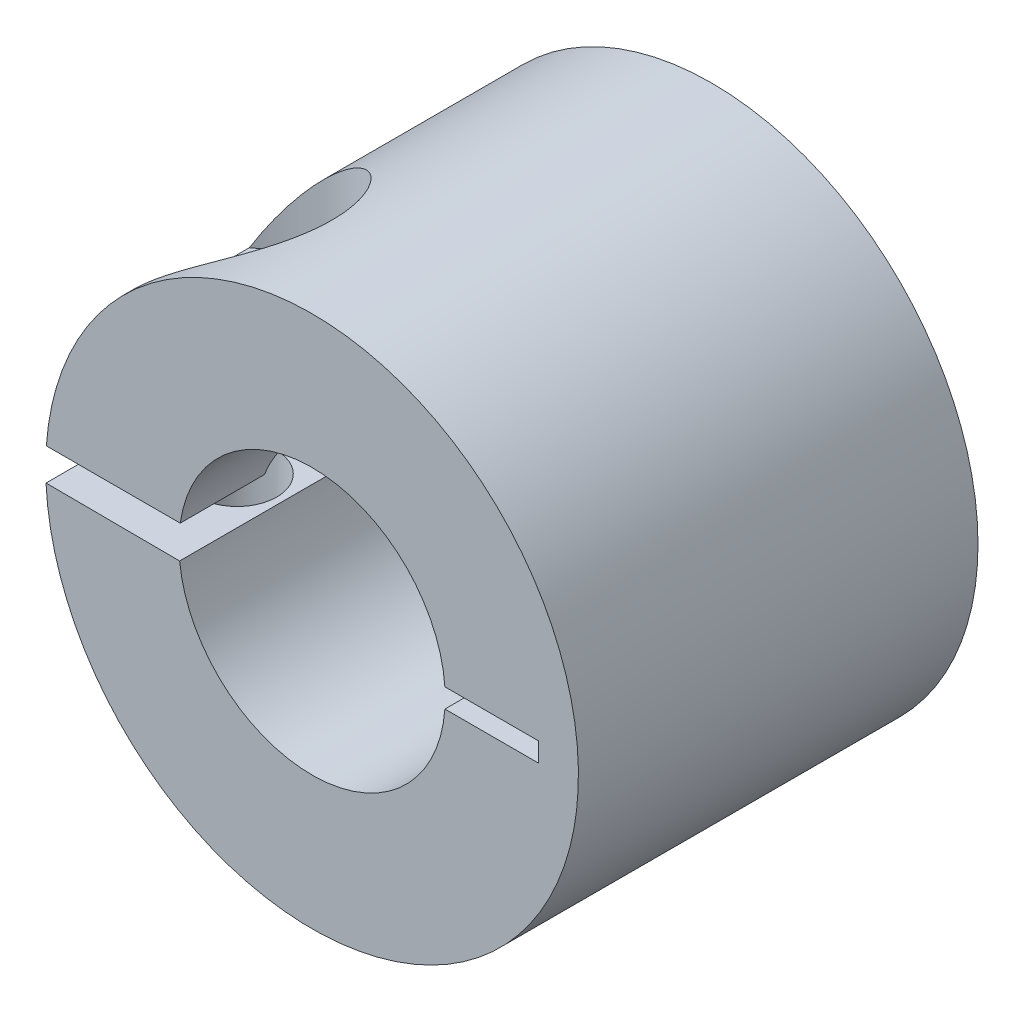
ISO-10303-21;
HEADER;
FILE_DESCRIPTION(('STEP AP214'),'2;1');
FILE_NAME('part.step','',(''),(''),'','','');
FILE_SCHEMA(('AUTOMOTIVE_DESIGN { 1 0 10303 214 1 1 1 1 }'));
ENDSEC;
DATA;
#1=APPLICATION_CONTEXT('core data for automotive mechanical design processes');
#2=APPLICATION_PROTOCOL_DEFINITION('international standard','automotive_design',2000,#1);
#3=PRODUCT_CONTEXT('',#1,'mechanical');
#4=PRODUCT('Part','Part','',(#3));
#5=PRODUCT_RELATED_PRODUCT_CATEGORY('part','',(#4));
#6=PRODUCT_DEFINITION_FORMATION('','',#4);
#7=PRODUCT_DEFINITION_CONTEXT('part definition',#1,'design');
#8=PRODUCT_DEFINITION('design','',#6,#7);
#9=PRODUCT_DEFINITION_SHAPE('','',#8);
#10=(LENGTH_UNIT() NAMED_UNIT(*) SI_UNIT(.MILLI.,.METRE.));
#11=(NAMED_UNIT(*) PLANE_ANGLE_UNIT() SI_UNIT($,.RADIAN.));
#12=(NAMED_UNIT(*) SI_UNIT($,.STERADIAN.) SOLID_ANGLE_UNIT());
#13=UNCERTAINTY_MEASURE_WITH_UNIT(LENGTH_MEASURE(1.E-05),#10,'distance_accuracy_value','');
#14=(GEOMETRIC_REPRESENTATION_CONTEXT(3) GLOBAL_UNCERTAINTY_ASSIGNED_CONTEXT((#13)) GLOBAL_UNIT_ASSIGNED_CONTEXT((#10,
#11,#12)) REPRESENTATION_CONTEXT('',''));
#15=CARTESIAN_POINT('',(0.,0.,0.));
#16=DIRECTION('',(0.,0.,1.));
#17=DIRECTION('',(1.,0.,0.));
#18=AXIS2_PLACEMENT_3D('',#15,#16,#17);
#19=CARTESIAN_POINT('',(0.,0.,11.));
#20=DIRECTION('',(0.,0.,-1.));
#21=DIRECTION('',(-1.,0.,0.));
#22=AXIS2_PLACEMENT_3D('',#19,#20,#21);
#23=CYLINDRICAL_SURFACE('',#22,14.);
#24=CARTESIAN_POINT('',(-11.5526790411999,-7.90794581234726,5.54027114214955));
#25=CARTESIAN_POINT('',(-11.5526748789258,-7.90795272536552,5.61203625396769));
#26=CARTESIAN_POINT('',(-11.5489929443179,-7.91333902765709,5.68383878191136));
#27=CARTESIAN_POINT('',(-11.5346125806077,-7.93428400988953,5.82523257353896));
#28=CARTESIAN_POINT('',(-11.5239050377526,-7.9498559026911,5.89482084173525));
#29=CARTESIAN_POINT('',(-11.4930315740365,-7.99444270107197,6.04637547896843));
#30=CARTESIAN_POINT('',(-11.4712136993282,-8.0257851887035,6.12731063718396));
#31=CARTESIAN_POINT('',(-11.4200360487427,-8.09844145867685,6.28196744460272));
#32=CARTESIAN_POINT('',(-11.3906615647856,-8.13977467725418,6.35567463454095));
#33=CARTESIAN_POINT('',(-11.3091277463506,-8.2529173406958,6.53230925769992));
#34=CARTESIAN_POINT('',(-11.253076026746,-8.32937719033758,6.63042241483548));
#35=CARTESIAN_POINT('',(-11.1309925227456,-8.49184379696413,6.81130122132944));
#36=CARTESIAN_POINT('',(-11.0649366745893,-8.57787343677205,6.89402876345338));
#37=CARTESIAN_POINT('',(-10.9411480975672,-8.73492227838304,7.02810304253912));
#38=CARTESIAN_POINT('',(-10.8850133399113,-8.80482293777624,7.08228561138151));
#39=CARTESIAN_POINT('',(-10.7686467885749,-8.94676862582325,7.18297814039746));
#40=CARTESIAN_POINT('',(-10.7084129430689,-9.01881471808823,7.22948421755897));
#41=CARTESIAN_POINT('',(-10.5842733070919,-9.16418592151429,7.31511557245384));
#42=CARTESIAN_POINT('',(-10.5203654099437,-9.2375117493447,7.35423655943337));
#43=CARTESIAN_POINT('',(-10.389224631331,-9.38476105263162,7.42518971782131));
#44=CARTESIAN_POINT('',(-10.3219904794634,-9.4586847472736,7.45701907778003));
#45=CARTESIAN_POINT('',(-10.182592794723,-9.60861899400804,7.51410739664203));
#46=CARTESIAN_POINT('',(-10.1103440248277,-9.68463015176237,7.53915795943815));
#47=CARTESIAN_POINT('',(-9.9630182447546,-9.83613128906178,7.58127339388821));
#48=CARTESIAN_POINT('',(-9.88794012609106,-9.91162105033572,7.59833509976474));
#49=CARTESIAN_POINT('',(-9.6591997402812,-10.136331792456,7.63697174553692));
#50=CARTESIAN_POINT('',(-9.5017128875386,-10.2841381621243,7.64613028362006));
#51=CARTESIAN_POINT('',(-9.21366194217896,-10.5422043793,7.62896872848511));
#52=CARTESIAN_POINT('',(-9.08406868497212,-10.6540277054776,7.60942698413341));
#53=CARTESIAN_POINT('',(-8.82485298807189,-10.8696923472061,7.54379001126941));
#54=CARTESIAN_POINT('',(-8.69523076566285,-10.9735429810364,7.49772633337225));
#55=CARTESIAN_POINT('',(-8.46626842026619,-11.1507402007235,7.38853257713525));
#56=CARTESIAN_POINT('',(-8.36600086590635,-11.2260619160469,7.33056517219441));
#57=CARTESIAN_POINT('',(-8.17249913866361,-11.367698676702,7.19509004534897));
#58=CARTESIAN_POINT('',(-8.07925750660957,-11.4340233355274,7.11760343711104));
#59=CARTESIAN_POINT('',(-7.9177287611714,-11.5463308689711,6.95663690844773));
#60=CARTESIAN_POINT('',(-7.84780677131883,-11.5938734475902,6.87589175195317));
#61=CARTESIAN_POINT('',(-7.71930708817429,-11.6798234243847,6.70145524757232));
#62=CARTESIAN_POINT('',(-7.66072639403324,-11.718233239658,6.60776733554656));
#63=CARTESIAN_POINT('',(-7.55771393519186,-11.7849383406645,6.40885136620978));
#64=CARTESIAN_POINT('',(-7.51336012446173,-11.8131780007852,6.303563836935));
#65=CARTESIAN_POINT('',(-7.44196736810731,-11.8582854006193,6.08496353574914));
#66=CARTESIAN_POINT('',(-7.41492053291054,-11.8751583221692,5.97165444675406));
#67=CARTESIAN_POINT('',(-7.38167099406705,-11.8958510127765,5.75260358252599));
#68=CARTESIAN_POINT('',(-7.37365073041132,-11.9008096348339,5.64724170998892));
#69=CARTESIAN_POINT('',(-7.37349563151818,-11.9009061484032,5.43652069042605));
#70=CARTESIAN_POINT('',(-7.38135542212497,-11.8960473623395,5.33116155454101));
#71=CARTESIAN_POINT('',(-7.41184930690597,-11.8770697162687,5.12806024394761));
#72=CARTESIAN_POINT('',(-7.43384907349553,-11.8633483140374,5.03018400576597));
#73=CARTESIAN_POINT('',(-7.49090277147222,-11.8274047849434,4.83997975565137));
#74=CARTESIAN_POINT('',(-7.52595710438304,-11.8051823966125,4.74765191447377));
#75=CARTESIAN_POINT('',(-7.60879262356816,-11.7519683687373,4.56784273288338));
#76=CARTESIAN_POINT('',(-7.65694190647032,-11.72072115828,4.48060768479597));
#77=CARTESIAN_POINT('',(-7.76328345396774,-11.6505571516576,4.31592543571808));
#78=CARTESIAN_POINT('',(-7.8214789059121,-11.611637920832,4.23848135465898));
#79=CARTESIAN_POINT('',(-7.95172290876239,-11.5228850709899,4.0873758424385));
#80=CARTESIAN_POINT('',(-8.02456781633038,-11.4723587279303,4.01481122766731));
#81=CARTESIAN_POINT('',(-8.17687376896012,-11.3643067592262,3.88315609158581));
#82=CARTESIAN_POINT('',(-8.25633755402731,-11.3067782303074,3.82407118867241));
#83=CARTESIAN_POINT('',(-8.43227889374561,-11.1763337594237,3.7110000067731));
#84=CARTESIAN_POINT('',(-8.52946705371654,-11.102420641021,3.65927610897239));
#85=CARTESIAN_POINT('',(-8.72638234325801,-10.9483313124023,3.57283851428569));
#86=CARTESIAN_POINT('',(-8.82611159843523,-10.868149734438,3.53813958519118));
#87=CARTESIAN_POINT('',(-9.07462507699103,-10.6624684421057,3.47149242727485));
#88=CARTESIAN_POINT('',(-9.22355341245232,-10.5339788058976,3.44918381523363));
#89=CARTESIAN_POINT('',(-9.51658227201342,-10.2700428050562,3.43571894696369));
#90=CARTESIAN_POINT('',(-9.66067455657346,-10.1345854736997,3.44461337858461));
#91=CARTESIAN_POINT('',(-9.94259351419262,-9.85821042006415,3.49069413946149));
#92=CARTESIAN_POINT('',(-10.0803074060227,-9.71724333195355,3.52826611726949));
#93=CARTESIAN_POINT('',(-10.3450195936689,-9.43493714409138,3.63022396600122));
#94=CARTESIAN_POINT('',(-10.4720158972395,-9.29359798018936,3.69461480902145));
#95=CARTESIAN_POINT('',(-10.6995514483679,-9.03029861622065,3.84136676800589));
#96=CARTESIAN_POINT('',(-10.8014586899949,-8.9079535625862,3.9208744940611));
#97=CARTESIAN_POINT('',(-10.9449799991573,-8.73002056309218,4.05695719505495));
#98=CARTESIAN_POINT('',(-10.9912447150344,-8.67166587537025,4.10509562126461));
#99=CARTESIAN_POINT('',(-11.0802674778176,-8.55762167637959,4.20736343795714));
#100=CARTESIAN_POINT('',(-11.1230275152752,-8.5019306598175,4.26148938607905));
#101=CARTESIAN_POINT('',(-11.2118132591722,-8.38460336312694,4.38651523718457));
#102=CARTESIAN_POINT('',(-11.2570453515027,-8.32369668439724,4.45868165866657));
#103=CARTESIAN_POINT('',(-11.3403830804186,-8.20979140182161,4.61279265260753));
#104=CARTESIAN_POINT('',(-11.3784972638176,-8.15678332940912,4.69472530199096));
#105=CARTESIAN_POINT('',(-11.4378529185415,-8.07326056692447,4.84908447087343));
#106=CARTESIAN_POINT('',(-11.4609610556731,-8.04036915957946,4.91948703353808));
#107=CARTESIAN_POINT('',(-11.500177306659,-7.98417842072217,5.06583382773657));
#108=CARTESIAN_POINT('',(-11.5163011640166,-7.9608575223113,5.14176514025932));
#109=CARTESIAN_POINT('',(-11.5362526340034,-7.93190223644919,5.27186319332464));
#110=CARTESIAN_POINT('',(-11.5423814754161,-7.92297183943813,5.32495430324541));
#111=CARTESIAN_POINT('',(-11.5505961045661,-7.91099123019591,5.4321136175016));
#112=CARTESIAN_POINT('',(-11.5526821783073,-7.907940602003,5.48618175244461));
#113=CARTESIAN_POINT('',(-11.5526790411999,-7.90794581234726,5.54027114214955));
#114=B_SPLINE_CURVE_WITH_KNOTS('',3,(#24,#25,#26,#27,#28,#29,#30,#31,#32,#33,#34,#35,#36,#37,
#38,#39,#40,#41,#42,#43,#44,#45,#46,#47,#48,#49,#50,#51,#52,#53,#54,#55,#56,#57,#58,#59,#60,#61,
#62,#63,#64,#65,#66,#67,#68,#69,#70,#71,#72,#73,#74,#75,#76,#77,#78,#79,#80,#81,#82,#83,#84,#85,
#86,#87,#88,#89,#90,#91,#92,#93,#94,#95,#96,#97,#98,#99,#100,#101,#102,#103,#104,#105,#106,#107,
#108,#109,#110,#111,#112,#113),.UNSPECIFIED.,.T.,.F.,(4,2,2,2,2,2,2,2,2,2,2,2,2,2,2,2,2,2,2,2,2,
2,2,2,2,2,2,2,2,2,2,2,2,2,2,2,2,2,2,2,2,2,2,2,4),(0.,0.215079784794149,0.430439128265852,
0.697419816850775,0.964924137378911,1.37197157967133,1.78001415150292,2.09387604448038,
2.4078962154056,2.72209827497759,3.03642127903091,3.35952540295322,3.6827574565495,
4.32777612987195,4.84279793422785,5.3572083284012,5.77009142272656,6.18252981031393,
6.53181094848055,6.88099954194917,7.2320700102893,7.58298032512158,7.89871738277954,
8.21434760604706,8.51672254266005,8.81910678028855,9.13107317638948,9.4431387326242,
9.78549501868036,10.1279937405405,10.5243445567022,10.9210385701807,11.5116865610515,
12.1032944752649,12.7030014898667,13.3028197369664,13.8348485190775,14.1006186327618,
14.3662367356438,14.6795785940402,14.9925417541482,15.2349169747665,15.4767429694361,
15.6388601472756,15.8009658557829),.UNSPECIFIED.);
#115=CARTESIAN_POINT('',(-11.5526790411999,-7.90794581234726,5.54027114214955));
#116=VERTEX_POINT('',#115);
#117=EDGE_CURVE('E43',#116,#116,#114,.T.);
#118=ORIENTED_EDGE('',*,*,#117,.T.);
#119=EDGE_LOOP('',(#118));
#120=FACE_BOUND('',#119,.T.);
#121=DIRECTION('',(0.,0.,-1.));
#122=VECTOR('',#121,1.);
#123=CARTESIAN_POINT('',(-13.9824890488067,-0.699999999999998,11.));
#124=LINE('',#123,#122);
#125=CARTESIAN_POINT('',(-13.9824890488067,-0.699999999999998,11.));
#126=VERTEX_POINT('',#125);
#127=CARTESIAN_POINT('',(-13.9824890488067,-0.699999999999998,0.));
#128=VERTEX_POINT('',#127);
#129=EDGE_CURVE('E141',#126,#128,#124,.T.);
#130=ORIENTED_EDGE('',*,*,#129,.T.);
#131=CARTESIAN_POINT('',(0.,0.,0.));
#132=DIRECTION('',(0.,0.,-1.));
#133=DIRECTION('',(-1.,0.,0.));
#134=AXIS2_PLACEMENT_3D('',#131,#132,#133);
#135=CIRCLE('',#134,14.);
#136=CARTESIAN_POINT('',(-13.9642400437689,0.999999999999997,0.));
#137=VERTEX_POINT('',#136);
#138=EDGE_CURVE('E123',#128,#137,#135,.T.);
#139=ORIENTED_EDGE('',*,*,#138,.T.);
#140=DIRECTION('',(0.,0.,-1.));
#141=VECTOR('',#140,1.);
#142=CARTESIAN_POINT('',(-13.9642400437689,0.999999999999997,11.));
#143=LINE('',#142,#141);
#144=CARTESIAN_POINT('',(-13.9642400437689,0.999999999999997,11.));
#145=VERTEX_POINT('',#144);
#146=EDGE_CURVE('E139',#145,#137,#143,.T.);
#147=ORIENTED_EDGE('',*,*,#146,.F.);
#148=CARTESIAN_POINT('',(0.,0.,11.));
#149=DIRECTION('',(0.,0.,1.));
#150=DIRECTION('',(1.,0.,0.));
#151=AXIS2_PLACEMENT_3D('',#148,#149,#150);
#152=CIRCLE('',#151,14.);
#153=EDGE_CURVE('E163',#126,#145,#152,.T.);
#154=ORIENTED_EDGE('',*,*,#153,.F.);
#155=EDGE_LOOP('',(#130,#139,#147,#154));
#156=FACE_BOUND('',#155,.T.);
#157=CARTESIAN_POINT('',(-12.6491106406735,6.,9.35442593403644));
#158=CARTESIAN_POINT('',(-12.500956486932,6.31227599624931,9.47681787649013));
#159=CARTESIAN_POINT('',(-12.3405082759256,6.62071713969175,9.595027209356));
#160=CARTESIAN_POINT('',(-11.9938645644629,7.22985334803777,9.81783943930698));
#161=CARTESIAN_POINT('',(-11.8075569322407,7.53050751817003,9.92237900453613));
#162=CARTESIAN_POINT('',(-11.4063771133862,8.12558688737435,10.1128241126341));
#163=CARTESIAN_POINT('',(-11.191119338448,8.41985164162372,10.1984275336711));
#164=CARTESIAN_POINT('',(-10.7348469820586,8.99428062173048,10.3417546798836));
#165=CARTESIAN_POINT('',(-10.4938875938753,9.27447323561755,10.399536734572));
#166=CARTESIAN_POINT('',(-10.111105535538,9.68513562920555,10.4597180018529));
#167=CARTESIAN_POINT('',(-9.97817326187482,9.82204754166175,10.4753844001848));
#168=CARTESIAN_POINT('',(-9.70635413348575,10.0907468684015,10.495994264198));
#169=CARTESIAN_POINT('',(-9.56746698580825,10.2225340299621,10.500937201717));
#170=CARTESIAN_POINT('',(-9.28509659773725,10.4796602274201,10.4987746505883));
#171=CARTESIAN_POINT('',(-9.14163787957379,10.6050265280419,10.4917253803653));
#172=CARTESIAN_POINT('',(-8.85046349435833,10.8492105396951,10.4643378431118));
#173=CARTESIAN_POINT('',(-8.70274853551694,10.9680293307158,10.4440017748504));
#174=CARTESIAN_POINT('',(-8.42696589058301,11.1808689222284,10.3929169861981));
#175=CARTESIAN_POINT('',(-8.29931338630754,11.275918855846,10.3642134339553));
#176=CARTESIAN_POINT('',(-8.04287674555101,11.4602378488305,10.2955538649891));
#177=CARTESIAN_POINT('',(-7.9140928452011,11.5495080833742,10.2556001446375));
#178=CARTESIAN_POINT('',(-7.65648113452862,11.7218740404341,10.1637664251669));
#179=CARTESIAN_POINT('',(-7.52765335567372,11.8049654388513,10.1118781760075));
#180=CARTESIAN_POINT('',(-7.27144174487425,11.9644852111992,9.99571094680343));
#181=CARTESIAN_POINT('',(-7.14405792085949,12.0409135485535,9.93143189874671));
#182=CARTESIAN_POINT('',(-6.89138277473682,12.187301524464,9.78970143210148));
#183=CARTESIAN_POINT('',(-6.76611365443462,12.2572096035384,9.71215685323777));
#184=CARTESIAN_POINT('',(-6.52036710350628,12.3896853138755,9.54422513678344));
#185=CARTESIAN_POINT('',(-6.39988979648997,12.4522527558599,9.45383766817175));
#186=CARTESIAN_POINT('',(-6.16558536674314,12.5699140951548,9.26057535810966));
#187=CARTESIAN_POINT('',(-6.05175481067235,12.6250118706712,9.15770704961592));
#188=CARTESIAN_POINT('',(-5.83245602679812,12.727809131632,8.94005814341485));
#189=CARTESIAN_POINT('',(-5.72698660654677,12.7755096729859,8.82527924978134));
#190=CARTESIAN_POINT('',(-5.53931496471028,12.857879777443,8.60056257743442));
#191=CARTESIAN_POINT('',(-5.45587773617908,12.893438152241,8.4919776438853));
#192=CARTESIAN_POINT('',(-5.29755558996942,12.9592922975084,8.26724196035305));
#193=CARTESIAN_POINT('',(-5.22267009361303,12.9895884241354,8.15109172313452));
#194=CARTESIAN_POINT('',(-5.0823519202249,13.045129190861,7.9121059671715));
#195=CARTESIAN_POINT('',(-5.01691711727757,13.0703749675197,7.7892719605143));
#196=CARTESIAN_POINT('',(-4.89623643956759,13.1160601957523,7.53783880130263));
#197=CARTESIAN_POINT('',(-4.84099042334093,13.1364997140587,7.40923972882281));
#198=CARTESIAN_POINT('',(-4.74394073903555,13.1718469157343,7.15420631467307));
#199=CARTESIAN_POINT('',(-4.70158193089423,13.1869894323796,7.02801529164613));
#200=CARTESIAN_POINT('',(-4.62697047612849,13.2133535576846,6.77223264919106));
#201=CARTESIAN_POINT('',(-4.5947211773827,13.2245738676023,6.64263991861358));
#202=CARTESIAN_POINT('',(-4.54067272313902,13.2432288059642,6.38108509643145));
#203=CARTESIAN_POINT('',(-4.51886905671711,13.2506650686276,6.24912405316646));
#204=CARTESIAN_POINT('',(-4.48589179947667,13.2618655900207,5.98367626309891));
#205=CARTESIAN_POINT('',(-4.47472213779674,13.2656284914999,5.85018897078707));
#206=CARTESIAN_POINT('',(-4.4631642245398,13.2695215434282,5.58344402317107));
#207=CARTESIAN_POINT('',(-4.46271607724366,13.2696718755101,5.45018925265614));
#208=CARTESIAN_POINT('',(-4.47245479097328,13.2663926698929,5.18406377295371));
#209=CARTESIAN_POINT('',(-4.4826455558806,13.2629618181011,5.0511932226997));
#210=CARTESIAN_POINT('',(-4.51356765953261,13.2524704404916,4.7868795921762));
#211=CARTESIAN_POINT('',(-4.53429505159633,13.2454112737129,4.65543599623044));
#212=CARTESIAN_POINT('',(-4.5861032906913,13.2275623801755,4.39481210142529));
#213=CARTESIAN_POINT('',(-4.61718794583875,13.2167712812199,4.26563265345429));
#214=CARTESIAN_POINT('',(-4.68940856151099,13.1913195518882,4.01051779682524));
#215=CARTESIAN_POINT('',(-4.73054360746613,13.1766592735915,3.88458209414352));
#216=CARTESIAN_POINT('',(-4.8224816795849,13.1432895840024,3.63679069295674));
#217=CARTESIAN_POINT('',(-4.87328824611019,13.1245786895941,3.51493650780275));
#218=CARTESIAN_POINT('',(-4.98402538146163,13.0829272591105,3.27627042759579));
#219=CARTESIAN_POINT('',(-5.04395159135242,13.059988742621,3.15945615765954));
#220=CARTESIAN_POINT('',(-5.17235346444303,13.0096700777335,2.93157182972329));
#221=CARTESIAN_POINT('',(-5.2408322562997,12.9822883028253,2.82050389495132));
#222=CARTESIAN_POINT('',(-5.38563147561945,12.922890109027,2.60486388153701));
#223=CARTESIAN_POINT('',(-5.46195371788637,12.8908726168288,2.50029331526606));
#224=CARTESIAN_POINT('',(-5.62161317345073,12.8220530234487,2.29830869975618));
#225=CARTESIAN_POINT('',(-5.70495290911052,12.785249199261,2.2008972475481));
#226=CARTESIAN_POINT('',(-5.96412459534015,12.6674809893009,1.92036302516261));
#227=CARTESIAN_POINT('',(-6.14926737905118,12.5790970278997,1.74870737359771));
#228=CARTESIAN_POINT('',(-6.54065079642689,12.3801897857891,1.43589870558128));
#229=CARTESIAN_POINT('',(-6.74727248775975,12.2692129944432,1.29551915238282));
#230=CARTESIAN_POINT('',(-7.16984255481183,12.0271634616187,1.05079837085135));
#231=CARTESIAN_POINT('',(-7.38579435776003,11.8960832897034,0.946470514206036));
#232=CARTESIAN_POINT('',(-7.83870189497883,11.6031768212412,0.764776264367528));
#233=CARTESIAN_POINT('',(-8.07582948935671,11.4396580883909,0.690601442321244));
#234=CARTESIAN_POINT('',(-8.54474981957597,11.0937913466636,0.579362894752212));
#235=CARTESIAN_POINT('',(-8.77654232231028,10.9114425169426,0.54230078780566));
#236=CARTESIAN_POINT('',(-9.1775922075404,10.5746823626089,0.505143882818916));
#237=CARTESIAN_POINT('',(-9.34899955776292,10.423455184049,0.498520221917963));
#238=CARTESIAN_POINT('',(-9.68416594507993,10.1128203041529,0.502027744528716));
#239=CARTESIAN_POINT('',(-9.84792139878057,9.95340884200901,0.512166698719126));
#240=CARTESIAN_POINT('',(-10.167435805749,9.62682296213807,0.547073831655499));
#241=CARTESIAN_POINT('',(-10.3231515197706,9.45961425295668,0.571913638720819));
#242=CARTESIAN_POINT('',(-10.6251443924191,9.11910740344452,0.63419315995688));
#243=CARTESIAN_POINT('',(-10.771419045262,8.94580766517053,0.671636202939817));
#244=CARTESIAN_POINT('',(-11.0888561433439,8.5508043176986,0.767720880478584));
#245=CARTESIAN_POINT('',(-11.2573240224764,8.32765339826738,0.829309375956062));
#246=CARTESIAN_POINT('',(-11.5789278372546,7.87437119911402,0.965837567771664));
#247=CARTESIAN_POINT('',(-11.7320547055648,7.64423589472931,1.04078508811136));
#248=CARTESIAN_POINT('',(-12.0209894597443,7.18117828168694,1.20001480567601));
#249=CARTESIAN_POINT('',(-12.1570033520541,6.94833561318879,1.28415723291185));
#250=CARTESIAN_POINT('',(-12.4141120258284,6.47776916716762,1.45989538826469));
#251=CARTESIAN_POINT('',(-12.5352287403123,6.24005318154711,1.55147982123464));
#252=CARTESIAN_POINT('',(-12.6491106406735,6.,1.64557406596356));
#253=B_SPLINE_CURVE_WITH_KNOTS('',3,(#157,#158,#159,#160,#161,#162,#163,#164,#165,#166,#167,
#168,#169,#170,#171,#172,#173,#174,#175,#176,#177,#178,#179,#180,#181,#182,#183,#184,#185,#186,
#187,#188,#189,#190,#191,#192,#193,#194,#195,#196,#197,#198,#199,#200,#201,#202,#203,#204,#205,
#206,#207,#208,#209,#210,#211,#212,#213,#214,#215,#216,#217,#218,#219,#220,#221,#222,#223,#224,
#225,#226,#227,#228,#229,#230,#231,#232,#233,#234,#235,#236,#237,#238,#239,#240,#241,#242,#243,
#244,#245,#246,#247,#248,#249,#250,#251,#252),.UNSPECIFIED.,.F.,.F.,(4,2,2,2,2,2,2,2,2,2,2,2,2,
2,2,2,2,2,2,2,2,2,2,2,2,2,2,2,2,2,2,2,2,2,2,2,2,2,2,2,2,2,2,2,2,2,2,4),(0.,1.10022960567514,
2.20538842866631,3.32707843361045,4.44640638175912,5.02044099477472,5.59450388004718,
6.16588301829457,6.73716762565681,7.22187184329614,7.7064771952783,8.19141855499419,
8.67636257658922,9.16486363455443,9.65337728575205,10.1416363242473,10.629825602503,
11.0537281839965,11.4776020638655,11.9013804451031,12.3251529420377,12.7265835878389,
13.1281470318548,13.529536904886,13.9310750292207,14.3303694346123,14.7298104100777,
15.1291018779497,15.5285403179796,15.9279424232733,16.3274910160355,16.7268492320593,
17.1263539692993,17.52595135226,17.925692984376,18.7243209378213,19.5409233116951,
20.3578282416832,21.2468198130402,22.1358501538036,22.8209844977863,23.5064365399191,
24.1952561923112,24.8842579211854,25.7422407553169,26.6007277466774,27.4476181601251,
28.2932463854136),.UNSPECIFIED.);
#254=CARTESIAN_POINT('',(-12.6491106406735,6.,9.35442593403644));
#255=VERTEX_POINT('',#254);
#256=CARTESIAN_POINT('',(-12.6491106406735,6.,1.64557406596356));
#257=VERTEX_POINT('',#256);
#258=EDGE_CURVE('E11',#255,#257,#253,.T.);
#259=ORIENTED_EDGE('',*,*,#258,.F.);
#260=DIRECTION('',(0.,0.,-1.));
#261=VECTOR('',#260,1.);
#262=CARTESIAN_POINT('',(-12.6491106406735,6.,11.));
#263=LINE('',#262,#261);
#264=EDGE_CURVE('E52',#257,#255,#263,.F.);
#265=ORIENTED_EDGE('',*,*,#264,.F.);
#266=EDGE_LOOP('',(#259,#265));
#267=FACE_BOUND('',#266,.T.);
#268=CARTESIAN_POINT('',(0.,0.,-10.));
#269=DIRECTION('',(0.,0.,-1.));
#270=DIRECTION('',(-1.,0.,0.));
#271=AXIS2_PLACEMENT_3D('',#268,#269,#270);
#272=CIRCLE('',#271,14.);
#273=CARTESIAN_POINT('',(-14.,0.,-10.));
#274=VERTEX_POINT('',#273);
#275=EDGE_CURVE('E142',#274,#274,#272,.T.);
#276=ORIENTED_EDGE('',*,*,#275,.F.);
#277=EDGE_LOOP('',(#276));
#278=FACE_BOUND('',#277,.T.);
#279=ADVANCED_FACE('F39',(#120,#156,#267,#278),#23,.T.);
#280=CARTESIAN_POINT('',(-13.9642400437689,0.999999999999997,11.));
#281=DIRECTION('',(0.,1.,0.));
#282=DIRECTION('',(-1.,0.,0.));
#283=AXIS2_PLACEMENT_3D('',#280,#281,#282);
#284=PLANE('',#283);
#285=DIRECTION('',(0.,0.,-1.));
#286=VECTOR('',#285,1.);
#287=CARTESIAN_POINT('',(-6.92820323027551,1.,11.));
#288=LINE('',#287,#286);
#289=CARTESIAN_POINT('',(-6.92820323027551,1.,4.43650703782015));
#290=VERTEX_POINT('',#289);
#291=CARTESIAN_POINT('',(-6.92820323027551,1.,0.));
#292=VERTEX_POINT('',#291);
#293=EDGE_CURVE('E154',#290,#292,#288,.T.);
#294=ORIENTED_EDGE('',*,*,#293,.F.);
#295=CARTESIAN_POINT('',(-9.46424004376894,0.999999999999998,5.5));
#296=DIRECTION('',(0.,1.,0.));
#297=DIRECTION('',(-1.,0.,0.));
#298=AXIS2_PLACEMENT_3D('',#295,#296,#297);
#299=CIRCLE('',#298,2.75);
#300=CARTESIAN_POINT('',(-6.92820323027551,1.,6.56349296217985));
#301=VERTEX_POINT('',#300);
#302=EDGE_CURVE('E59',#290,#301,#299,.T.);
#303=ORIENTED_EDGE('',*,*,#302,.T.);
#304=CARTESIAN_POINT('',(-6.92820323027551,1.,11.));
#305=VERTEX_POINT('',#304);
#306=EDGE_CURVE('E150',#305,#301,#288,.T.);
#307=ORIENTED_EDGE('',*,*,#306,.F.);
#308=DIRECTION('',(1.,0.,0.));
#309=VECTOR('',#308,1.);
#310=CARTESIAN_POINT('',(-13.9642400437689,0.999999999999997,11.));
#311=LINE('',#310,#309);
#312=EDGE_CURVE('E147',#145,#305,#311,.T.);
#313=ORIENTED_EDGE('',*,*,#312,.F.);
#314=ORIENTED_EDGE('',*,*,#146,.T.);
#315=DIRECTION('',(1.,0.,0.));
#316=VECTOR('',#315,1.);
#317=CARTESIAN_POINT('',(-13.9642400437689,0.999999999999997,0.));
#318=LINE('',#317,#316);
#319=EDGE_CURVE('E120',#137,#292,#318,.T.);
#320=ORIENTED_EDGE('',*,*,#319,.T.);
#321=EDGE_LOOP('',(#294,#303,#307,#313,#314,#320));
#322=FACE_BOUND('',#321,.T.);
#323=ADVANCED_FACE('F145',(#322),#284,.F.);
#324=CARTESIAN_POINT('',(0.,0.,11.));
#325=DIRECTION('',(0.,0.,-1.));
#326=DIRECTION('',(-1.,0.,0.));
#327=AXIS2_PLACEMENT_3D('',#324,#325,#326);
#328=CYLINDRICAL_SURFACE('',#327,7.);
#329=ORIENTED_EDGE('',*,*,#306,.T.);
#330=CARTESIAN_POINT('',(-6.92820323027551,1.,6.56349296217985));
#331=CARTESIAN_POINT('',(-6.92038793607714,1.05420654643637,6.5448162167487));
#332=CARTESIAN_POINT('',(-6.91200327221809,1.10773822374635,6.52428133456131));
#333=CARTESIAN_POINT('',(-6.89428716314602,1.21311166378782,6.47900930955239));
#334=CARTESIAN_POINT('',(-6.88495168935421,1.26494489240808,6.45425395884631));
#335=CARTESIAN_POINT('',(-6.86546663377892,1.36678393077329,6.39984322661518));
#336=CARTESIAN_POINT('',(-6.85530764895472,1.41675496503644,6.37012534635765));
#337=CARTESIAN_POINT('',(-6.83467806253365,1.51314115085912,6.30563617467448));
#338=CARTESIAN_POINT('',(-6.82420813616006,1.55956332231812,6.27087527553159));
#339=CARTESIAN_POINT('',(-6.80368111449499,1.64677971602972,6.19668652408971));
#340=CARTESIAN_POINT('',(-6.79362007110174,1.6876792430516,6.1573851541421));
#341=CARTESIAN_POINT('',(-6.77433101406092,1.76350944532283,6.07335805503318));
#342=CARTESIAN_POINT('',(-6.76510055447825,1.79845793611358,6.02864922686688));
#343=CARTESIAN_POINT('',(-6.74813966393345,1.86109655133048,5.93321220675425));
#344=CARTESIAN_POINT('',(-6.74042986936613,1.88868840094764,5.88241450636992));
#345=CARTESIAN_POINT('',(-6.72762449763887,1.93381229094092,5.7761832429322));
#346=CARTESIAN_POINT('',(-6.72252580425721,1.9513563258679,5.72075529821622));
#347=CARTESIAN_POINT('',(-6.71615563269196,1.97316186364681,5.61414450023007));
#348=CARTESIAN_POINT('',(-6.71449449488946,1.97877792997466,5.5632638286212));
#349=CARTESIAN_POINT('',(-6.71404066609743,1.98031835934532,5.46134937976111));
#350=CARTESIAN_POINT('',(-6.7152466669536,1.9762471422857,5.41031568293994));
#351=CARTESIAN_POINT('',(-6.72000336919784,1.96000236312224,5.31679960230577));
#352=CARTESIAN_POINT('',(-6.7232171724871,1.94899124753231,5.27408973480623));
#353=CARTESIAN_POINT('',(-6.73133919414643,1.92075202263485,5.19097185905659));
#354=CARTESIAN_POINT('',(-6.73624774334959,1.90352269943484,5.15056430203851));
#355=CARTESIAN_POINT('',(-6.74938387816267,1.85650283606498,5.05848293438999));
#356=CARTESIAN_POINT('',(-6.75816926810022,1.82442283246807,5.00805931376136));
#357=CARTESIAN_POINT('',(-6.77713129821511,1.75267635804842,4.91323094425344));
#358=CARTESIAN_POINT('',(-6.78731085193836,1.71299392839383,4.86883919848817));
#359=CARTESIAN_POINT('',(-6.81287746631068,1.60893975767694,4.76745916378125));
#360=CARTESIAN_POINT('',(-6.82855395650522,1.54147289491173,4.71374039383642));
#361=CARTESIAN_POINT('',(-6.85919707659215,1.39884541611027,4.61749989079072));
#362=CARTESIAN_POINT('',(-6.8741621320411,1.32366880128862,4.57500212334916));
#363=CARTESIAN_POINT('',(-6.89543899479313,1.20606041013293,4.51807329568608));
#364=CARTESIAN_POINT('',(-6.90242625822608,1.16543912473962,4.50002914450092));
#365=CARTESIAN_POINT('',(-6.91578426739934,1.08335119370539,4.46646524788989));
#366=CARTESIAN_POINT('',(-6.9221584039382,1.04189094121351,4.45093125142833));
#367=CARTESIAN_POINT('',(-6.92820323027551,1.,4.43650703782015));
#368=B_SPLINE_CURVE_WITH_KNOTS('',3,(#330,#331,#332,#333,#334,#335,#336,#337,#338,#339,#340,
#341,#342,#343,#344,#345,#346,#347,#348,#349,#350,#351,#352,#353,#354,#355,#356,#357,#358,#359,
#360,#361,#362,#363,#364,#365,#366,#367),.UNSPECIFIED.,.F.,.F.,(4,2,2,2,2,2,2,2,2,2,2,2,2,2,2,2,
2,2,4),(0.,0.173622280488841,0.348013485919235,0.524794455708795,0.701216170849748,
0.873558973814341,1.04537640208349,1.21938554243262,1.39318652455012,1.54587598125028,
1.69849578557047,1.83060429337601,1.96273860481441,2.1429499002376,2.32354372015675,
2.5850646272155,2.84713964974499,2.98205404572411,3.11617331297004),.UNSPECIFIED.);
#369=EDGE_CURVE('E213',#301,#290,#368,.T.);
#370=ORIENTED_EDGE('',*,*,#369,.T.);
#371=ORIENTED_EDGE('',*,*,#293,.T.);
#372=CARTESIAN_POINT('',(0.,0.,0.));
#373=DIRECTION('',(0.,0.,-1.));
#374=DIRECTION('',(-1.,0.,0.));
#375=AXIS2_PLACEMENT_3D('',#372,#373,#374);
#376=CIRCLE('',#375,7.);
#377=CARTESIAN_POINT('',(-6.96111081020202,-0.736842105263156,0.));
#378=VERTEX_POINT('',#377);
#379=EDGE_CURVE('E126',#378,#292,#376,.T.);
#380=ORIENTED_EDGE('',*,*,#379,.F.);
#381=DIRECTION('',(0.,0.,-1.));
#382=VECTOR('',#381,1.);
#383=CARTESIAN_POINT('',(-6.96111081020202,-0.736842105263156,11.));
#384=LINE('',#383,#382);
#385=CARTESIAN_POINT('',(-6.96111081020202,-0.736842105263156,11.));
#386=VERTEX_POINT('',#385);
#387=EDGE_CURVE('E170',#386,#378,#384,.T.);
#388=ORIENTED_EDGE('',*,*,#387,.F.);
#389=CARTESIAN_POINT('',(0.,0.,11.));
#390=DIRECTION('',(0.,0.,-1.));
#391=DIRECTION('',(1.,0.,0.));
#392=AXIS2_PLACEMENT_3D('',#389,#390,#391);
#393=CIRCLE('',#392,7.);
#394=CARTESIAN_POINT('',(6.98170116948646,-0.505814966159976,11.));
#395=VERTEX_POINT('',#394);
#396=EDGE_CURVE('E295',#395,#386,#393,.T.);
#397=ORIENTED_EDGE('',*,*,#396,.F.);
#398=DIRECTION('',(0.,0.,-1.));
#399=VECTOR('',#398,1.);
#400=CARTESIAN_POINT('',(6.98170116948646,-0.505814966159976,11.));
#401=LINE('',#400,#399);
#402=CARTESIAN_POINT('',(6.98170116948646,-0.505814966159976,8.56901178174177));
#403=VERTEX_POINT('',#402);
#404=EDGE_CURVE('E287',#395,#403,#401,.T.);
#405=ORIENTED_EDGE('',*,*,#404,.T.);
#406=CARTESIAN_POINT('',(0.,0.,8.56901178174177));
#407=DIRECTION('',(0.,0.,1.));
#408=DIRECTION('',(1.,0.,0.));
#409=AXIS2_PLACEMENT_3D('',#406,#407,#408);
#410=CIRCLE('',#409,7.);
#411=CARTESIAN_POINT('',(6.98170116948646,0.505814966159976,8.56901178174177));
#412=VERTEX_POINT('',#411);
#413=EDGE_CURVE('E149',#412,#403,#410,.F.);
#414=ORIENTED_EDGE('',*,*,#413,.F.);
#415=DIRECTION('',(0.,0.,-1.));
#416=VECTOR('',#415,1.);
#417=CARTESIAN_POINT('',(6.98170116948646,0.505814966159976,11.));
#418=LINE('',#417,#416);
#419=CARTESIAN_POINT('',(6.98170116948646,0.505814966159976,11.));
#420=VERTEX_POINT('',#419);
#421=EDGE_CURVE('E132',#412,#420,#418,.F.);
#422=ORIENTED_EDGE('',*,*,#421,.T.);
#423=EDGE_CURVE('E296',#305,#420,#393,.T.);
#424=ORIENTED_EDGE('',*,*,#423,.F.);
#425=EDGE_LOOP('',(#329,#370,#371,#380,#388,#397,#405,#414,#422,#424));
#426=FACE_BOUND('',#425,.T.);
#427=CARTESIAN_POINT('',(0.,0.,-10.));
#428=DIRECTION('',(0.,0.,-1.));
#429=DIRECTION('',(-1.,0.,0.));
#430=AXIS2_PLACEMENT_3D('',#427,#428,#429);
#431=CIRCLE('',#430,7.);
#432=CARTESIAN_POINT('',(-7.,0.,-10.));
#433=VERTEX_POINT('',#432);
#434=EDGE_CURVE('E143',#433,#433,#431,.T.);
#435=ORIENTED_EDGE('',*,*,#434,.T.);
#436=EDGE_LOOP('',(#435));
#437=FACE_BOUND('',#436,.T.);
#438=ADVANCED_FACE('F207',(#426,#437),#328,.F.);
#439=CARTESIAN_POINT('',(-13.9824890488067,-0.699999999999998,11.));
#440=DIRECTION('',(-0.00524706074018319,-0.999986234082044,0.));
#441=DIRECTION('',(0.999986234082044,-0.00524706074018319,0.));
#442=AXIS2_PLACEMENT_3D('',#439,#440,#441);
#443=PLANE('',#442);
#444=CARTESIAN_POINT('',(-9.41495483744257,-0.723966459360203,5.54027114214955));
#445=DIRECTION('',(0.00524706074018319,0.999986234082044,0.));
#446=DIRECTION('',(-0.999986234082044,0.00524706074018319,0.));
#447=AXIS2_PLACEMENT_3D('',#444,#445,#446);
#448=CIRCLE('',#447,2.09999999999999);
#449=CARTESIAN_POINT('',(-11.5149259290148,-0.712947631805819,5.54027114214955));
#450=VERTEX_POINT('',#449);
#451=EDGE_CURVE('E248',#450,#450,#448,.T.);
#452=ORIENTED_EDGE('',*,*,#451,.F.);
#453=EDGE_LOOP('',(#452));
#454=FACE_BOUND('',#453,.T.);
#455=DIRECTION('',(-0.999986234082044,0.00524706074018319,0.));
#456=VECTOR('',#455,1.);
#457=CARTESIAN_POINT('',(-13.9824890488067,-0.699999999999998,0.));
#458=LINE('',#457,#456);
#459=EDGE_CURVE('E131',#378,#128,#458,.T.);
#460=ORIENTED_EDGE('',*,*,#459,.T.);
#461=ORIENTED_EDGE('',*,*,#129,.F.);
#462=DIRECTION('',(-0.999986234082044,0.00524706074018319,0.));
#463=VECTOR('',#462,1.);
#464=CARTESIAN_POINT('',(-13.9824890488067,-0.699999999999998,11.));
#465=LINE('',#464,#463);
#466=EDGE_CURVE('E298',#386,#126,#465,.T.);
#467=ORIENTED_EDGE('',*,*,#466,.F.);
#468=ORIENTED_EDGE('',*,*,#387,.T.);
#469=EDGE_LOOP('',(#460,#461,#467,#468));
#470=FACE_BOUND('',#469,.T.);
#471=ADVANCED_FACE('F203',(#454,#470),#443,.F.);
#472=CARTESIAN_POINT('',(0.,0.,11.));
#473=DIRECTION('',(0.,0.,1.));
#474=DIRECTION('',(1.,0.,0.));
#475=AXIS2_PLACEMENT_3D('',#472,#473,#474);
#476=PLANE('',#475);
#477=DIRECTION('',(-1.,0.,0.));
#478=VECTOR('',#477,1.);
#479=CARTESIAN_POINT('',(6.98170116948646,0.505814966159976,11.));
#480=LINE('',#479,#478);
#481=CARTESIAN_POINT('',(11.8987778179927,0.505814966159976,11.));
#482=VERTEX_POINT('',#481);
#483=EDGE_CURVE('E275',#482,#420,#480,.T.);
#484=ORIENTED_EDGE('',*,*,#483,.F.);
#485=DIRECTION('',(0.,1.,0.));
#486=VECTOR('',#485,1.);
#487=CARTESIAN_POINT('',(11.8987778179927,0.505814966159976,11.));
#488=LINE('',#487,#486);
#489=CARTESIAN_POINT('',(11.8987778179927,-0.505814966159976,11.));
#490=VERTEX_POINT('',#489);
#491=EDGE_CURVE('E269',#490,#482,#488,.T.);
#492=ORIENTED_EDGE('',*,*,#491,.F.);
#493=DIRECTION('',(1.,0.,0.));
#494=VECTOR('',#493,1.);
#495=CARTESIAN_POINT('',(6.98170116948646,-0.505814966159976,11.));
#496=LINE('',#495,#494);
#497=EDGE_CURVE('E266',#395,#490,#496,.T.);
#498=ORIENTED_EDGE('',*,*,#497,.F.);
#499=ORIENTED_EDGE('',*,*,#396,.T.);
#500=ORIENTED_EDGE('',*,*,#466,.T.);
#501=ORIENTED_EDGE('',*,*,#153,.T.);
#502=ORIENTED_EDGE('',*,*,#312,.T.);
#503=ORIENTED_EDGE('',*,*,#423,.T.);
#504=EDGE_LOOP('',(#484,#492,#498,#499,#500,#501,#502,#503));
#505=FACE_BOUND('',#504,.T.);
#506=ADVANCED_FACE('F189',(#505),#476,.T.);
#507=CARTESIAN_POINT('',(-2.43098821825826,0.,8.56901178174177));
#508=DIRECTION('',(0.,0.,1.));
#509=DIRECTION('',(1.,0.,0.));
#510=AXIS2_PLACEMENT_3D('',#507,#508,#509);
#511=PLANE('',#510);
#512=ORIENTED_EDGE('',*,*,#413,.T.);
#513=DIRECTION('',(1.,0.,0.));
#514=VECTOR('',#513,1.);
#515=CARTESIAN_POINT('',(4.5507129512282,-0.505814966159976,8.56901178174177));
#516=LINE('',#515,#514);
#517=CARTESIAN_POINT('',(9.46778959973443,-0.505814966159976,8.56901178174177));
#518=VERTEX_POINT('',#517);
#519=EDGE_CURVE('E272',#403,#518,#516,.T.);
#520=ORIENTED_EDGE('',*,*,#519,.T.);
#521=DIRECTION('',(0.,1.,0.));
#522=VECTOR('',#521,1.);
#523=CARTESIAN_POINT('',(9.46778959973443,0.505814966159976,8.56901178174177));
#524=LINE('',#523,#522);
#525=CARTESIAN_POINT('',(9.46778959973443,0.505814966159976,8.56901178174177));
#526=VERTEX_POINT('',#525);
#527=EDGE_CURVE('E274',#518,#526,#524,.T.);
#528=ORIENTED_EDGE('',*,*,#527,.T.);
#529=DIRECTION('',(-1.,0.,0.));
#530=VECTOR('',#529,1.);
#531=CARTESIAN_POINT('',(4.5507129512282,0.505814966159976,8.56901178174177));
#532=LINE('',#531,#530);
#533=EDGE_CURVE('E278',#526,#412,#532,.T.);
#534=ORIENTED_EDGE('',*,*,#533,.T.);
#535=EDGE_LOOP('',(#512,#520,#528,#534));
#536=FACE_BOUND('',#535,.T.);
#537=ADVANCED_FACE('F185',(#536),#511,.T.);
#538=CARTESIAN_POINT('',(4.5507129512282,0.505814966159976,8.56901178174177));
#539=DIRECTION('',(0.,1.,0.));
#540=DIRECTION('',(0.,0.,1.));
#541=AXIS2_PLACEMENT_3D('',#538,#539,#540);
#542=PLANE('',#541);
#543=ORIENTED_EDGE('',*,*,#533,.F.);
#544=DIRECTION('',(0.707106781186552,0.,0.707106781186543));
#545=VECTOR('',#544,1.);
#546=CARTESIAN_POINT('',(9.46778959973443,0.505814966159976,8.56901178174177));
#547=LINE('',#546,#545);
#548=EDGE_CURVE('E285',#526,#482,#547,.T.);
#549=ORIENTED_EDGE('',*,*,#548,.T.);
#550=ORIENTED_EDGE('',*,*,#483,.T.);
#551=ORIENTED_EDGE('',*,*,#421,.F.);
#552=EDGE_LOOP('',(#543,#549,#550,#551));
#553=FACE_BOUND('',#552,.T.);
#554=ADVANCED_FACE('F188',(#553),#542,.F.);
#555=CARTESIAN_POINT('',(4.5507129512282,-0.505814966159976,8.56901178174177));
#556=DIRECTION('',(0.,-1.,0.));
#557=DIRECTION('',(0.,0.,-1.));
#558=AXIS2_PLACEMENT_3D('',#555,#556,#557);
#559=PLANE('',#558);
#560=ORIENTED_EDGE('',*,*,#497,.T.);
#561=DIRECTION('',(0.707106781186552,0.,0.707106781186543));
#562=VECTOR('',#561,1.);
#563=CARTESIAN_POINT('',(9.46778959973443,-0.505814966159976,8.56901178174177));
#564=LINE('',#563,#562);
#565=EDGE_CURVE('E280',#518,#490,#564,.T.);
#566=ORIENTED_EDGE('',*,*,#565,.F.);
#567=ORIENTED_EDGE('',*,*,#519,.F.);
#568=ORIENTED_EDGE('',*,*,#404,.F.);
#569=EDGE_LOOP('',(#560,#566,#567,#568));
#570=FACE_BOUND('',#569,.T.);
#571=ADVANCED_FACE('F193',(#570),#559,.F.);
#572=CARTESIAN_POINT('',(9.46778959973443,0.505814966159976,8.56901178174177));
#573=DIRECTION('',(0.707106781186543,0.,-0.707106781186552));
#574=DIRECTION('',(-0.707106781186552,0.,-0.707106781186543));
#575=AXIS2_PLACEMENT_3D('',#572,#573,#574);
#576=PLANE('',#575);
#577=ORIENTED_EDGE('',*,*,#491,.T.);
#578=ORIENTED_EDGE('',*,*,#548,.F.);
#579=ORIENTED_EDGE('',*,*,#527,.F.);
#580=ORIENTED_EDGE('',*,*,#565,.T.);
#581=EDGE_LOOP('',(#577,#578,#579,#580));
#582=FACE_BOUND('',#581,.T.);
#583=ADVANCED_FACE('F182',(#582),#576,.F.);
#584=CARTESIAN_POINT('',(-9.46424004376894,21.,5.5));
#585=DIRECTION('',(0.,-1.,0.));
#586=DIRECTION('',(0.,0.,-1.));
#587=AXIS2_PLACEMENT_3D('',#584,#585,#586);
#588=CYLINDRICAL_SURFACE('',#587,5.);
#589=ORIENTED_EDGE('',*,*,#258,.T.);
#590=CARTESIAN_POINT('',(-9.46424004376894,6.,5.5));
#591=DIRECTION('',(0.,1.,0.));
#592=DIRECTION('',(0.,0.,1.));
#593=AXIS2_PLACEMENT_3D('',#590,#591,#592);
#594=CIRCLE('',#593,5.);
#595=EDGE_CURVE('E66',#255,#257,#594,.T.);
#596=ORIENTED_EDGE('',*,*,#595,.F.);
#597=EDGE_LOOP('',(#589,#596));
#598=FACE_BOUND('',#597,.T.);
#599=ADVANCED_FACE('F176',(#598),#588,.F.);
#600=CARTESIAN_POINT('',(-9.46424004376894,6.,5.5));
#601=DIRECTION('',(0.,1.,0.));
#602=DIRECTION('',(0.,0.,1.));
#603=AXIS2_PLACEMENT_3D('',#600,#601,#602);
#604=PLANE('',#603);
#605=CARTESIAN_POINT('',(-9.46424004376894,6.,5.5));
#606=DIRECTION('',(0.,1.,0.));
#607=DIRECTION('',(0.,0.,1.));
#608=AXIS2_PLACEMENT_3D('',#605,#606,#607);
#609=CIRCLE('',#608,2.75);
#610=CARTESIAN_POINT('',(-9.46424004376894,6.,8.25));
#611=VERTEX_POINT('',#610);
#612=EDGE_CURVE('E220',#611,#611,#609,.T.);
#613=ORIENTED_EDGE('',*,*,#612,.F.);
#614=EDGE_LOOP('',(#613));
#615=FACE_BOUND('',#614,.T.);
#616=ORIENTED_EDGE('',*,*,#264,.T.);
#617=ORIENTED_EDGE('',*,*,#595,.T.);
#618=EDGE_LOOP('',(#616,#617));
#619=FACE_BOUND('',#618,.T.);
#620=ADVANCED_FACE('F181',(#615,#619),#604,.T.);
#621=CARTESIAN_POINT('',(-9.46424004376894,0.,5.5));
#622=DIRECTION('',(0.,1.,0.));
#623=DIRECTION('',(0.,0.,1.));
#624=AXIS2_PLACEMENT_3D('',#621,#622,#623);
#625=CYLINDRICAL_SURFACE('',#624,2.75);
#626=ORIENTED_EDGE('',*,*,#612,.T.);
#627=EDGE_LOOP('',(#626));
#628=FACE_BOUND('',#627,.T.);
#629=ORIENTED_EDGE('',*,*,#369,.F.);
#630=ORIENTED_EDGE('',*,*,#302,.F.);
#631=EDGE_LOOP('',(#629,#630));
#632=FACE_BOUND('',#631,.T.);
#633=ADVANCED_FACE('F223',(#628,#632),#625,.F.);
#634=CARTESIAN_POINT('',(0.,0.,-10.));
#635=DIRECTION('',(0.,0.,-1.));
#636=DIRECTION('',(-1.,0.,0.));
#637=AXIS2_PLACEMENT_3D('',#634,#635,#636);
#638=PLANE('',#637);
#639=ORIENTED_EDGE('',*,*,#275,.T.);
#640=EDGE_LOOP('',(#639));
#641=FACE_BOUND('',#640,.T.);
#642=ORIENTED_EDGE('',*,*,#434,.F.);
#643=EDGE_LOOP('',(#642));
#644=FACE_BOUND('',#643,.T.);
#645=ADVANCED_FACE('F227',(#641,#644),#638,.T.);
#646=CARTESIAN_POINT('',(0.,0.,0.));
#647=DIRECTION('',(0.,0.,-1.));
#648=DIRECTION('',(-1.,0.,0.));
#649=AXIS2_PLACEMENT_3D('',#646,#647,#648);
#650=PLANE('',#649);
#651=ORIENTED_EDGE('',*,*,#459,.F.);
#652=ORIENTED_EDGE('',*,*,#379,.T.);
#653=ORIENTED_EDGE('',*,*,#319,.F.);
#654=ORIENTED_EDGE('',*,*,#138,.F.);
#655=EDGE_LOOP('',(#651,#652,#653,#654));
#656=FACE_BOUND('',#655,.T.);
#657=ADVANCED_FACE('F122',(#656),#650,.F.);
#658=CARTESIAN_POINT('',(-9.41495483744257,-0.723966459360204,5.54027114214955));
#659=DIRECTION('',(0.00524706074018319,0.999986234082044,0.));
#660=DIRECTION('',(-0.999986234082044,0.00524706074018319,0.));
#661=AXIS2_PLACEMENT_3D('',#658,#659,#660);
#662=CYLINDRICAL_SURFACE('',#661,2.09999999999999);
#663=ORIENTED_EDGE('',*,*,#451,.T.);
#664=EDGE_LOOP('',(#663));
#665=FACE_BOUND('',#664,.T.);
#666=ORIENTED_EDGE('',*,*,#117,.F.);
#667=EDGE_LOOP('',(#666));
#668=FACE_BOUND('',#667,.T.);
#669=ADVANCED_FACE('F231',(#665,#668),#662,.F.);
#670=CLOSED_SHELL('',(#279,#323,#438,#471,#506,#537,#554,#571,#583,#599,#620,#633,#645,#657,#669));
#671=MANIFOLD_SOLID_BREP('B2',#670);
#672=ADVANCED_BREP_SHAPE_REPRESENTATION('',(#18,#671),#14);
#673=SHAPE_DEFINITION_REPRESENTATION(#9,#672);
ENDSEC;
END-ISO-10303-21;
